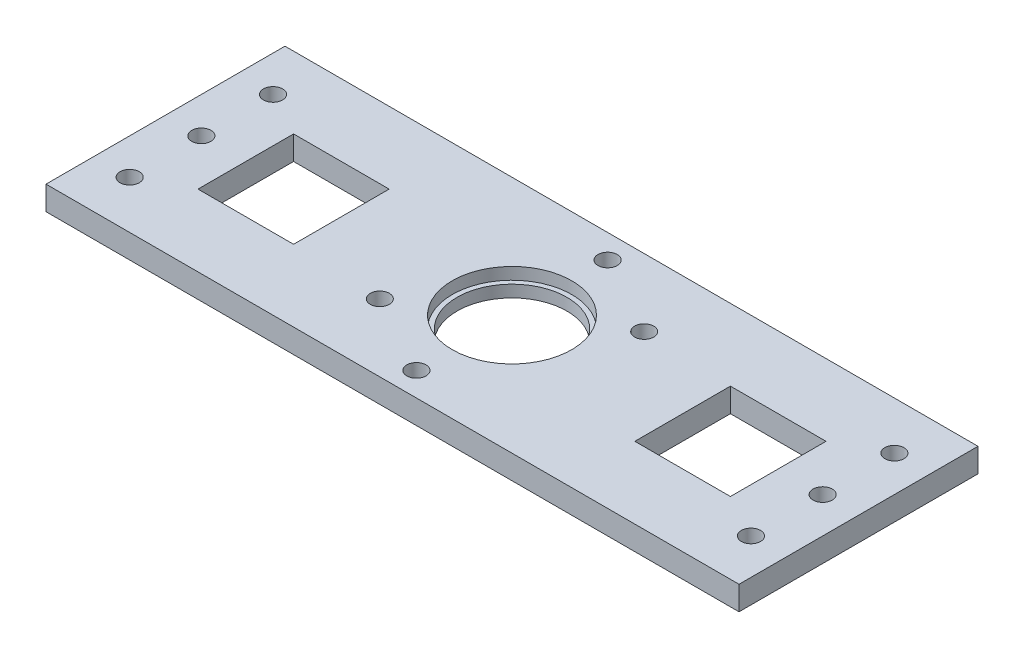
ISO-10303-21;
HEADER;
FILE_DESCRIPTION(('STEP AP214'),'2;1');
FILE_NAME('part.step','',(''),(''),'','','');
FILE_SCHEMA(('AUTOMOTIVE_DESIGN { 1 0 10303 214 1 1 1 1 }'));
ENDSEC;
DATA;
#1=APPLICATION_CONTEXT('core data for automotive mechanical design processes');
#2=APPLICATION_PROTOCOL_DEFINITION('international standard','automotive_design',2000,#1);
#3=PRODUCT_CONTEXT('',#1,'mechanical');
#4=PRODUCT('Part','Part','',(#3));
#5=PRODUCT_RELATED_PRODUCT_CATEGORY('part','',(#4));
#6=PRODUCT_DEFINITION_FORMATION('','',#4);
#7=PRODUCT_DEFINITION_CONTEXT('part definition',#1,'design');
#8=PRODUCT_DEFINITION('design','',#6,#7);
#9=PRODUCT_DEFINITION_SHAPE('','',#8);
#10=(LENGTH_UNIT() NAMED_UNIT(*) SI_UNIT(.MILLI.,.METRE.));
#11=(NAMED_UNIT(*) PLANE_ANGLE_UNIT() SI_UNIT($,.RADIAN.));
#12=(NAMED_UNIT(*) SI_UNIT($,.STERADIAN.) SOLID_ANGLE_UNIT());
#13=UNCERTAINTY_MEASURE_WITH_UNIT(LENGTH_MEASURE(1.E-05),#10,'distance_accuracy_value','');
#14=(GEOMETRIC_REPRESENTATION_CONTEXT(3) GLOBAL_UNCERTAINTY_ASSIGNED_CONTEXT((#13)) GLOBAL_UNIT_ASSIGNED_CONTEXT((#10,
#11,#12)) REPRESENTATION_CONTEXT('',''));
#15=CARTESIAN_POINT('',(0.,0.,0.));
#16=DIRECTION('',(0.,0.,1.));
#17=DIRECTION('',(1.,0.,0.));
#18=AXIS2_PLACEMENT_3D('',#15,#16,#17);
#19=CARTESIAN_POINT('',(0.,0.,0.));
#20=DIRECTION('',(0.,1.,0.));
#21=DIRECTION('',(0.,0.,1.));
#22=AXIS2_PLACEMENT_3D('',#19,#20,#21);
#23=CYLINDRICAL_SURFACE('',#22,14.605);
#24=CARTESIAN_POINT('',(0.,0.,0.));
#25=DIRECTION('',(0.,1.,0.));
#26=DIRECTION('',(0.,0.,1.));
#27=AXIS2_PLACEMENT_3D('',#24,#25,#26);
#28=CIRCLE('',#27,14.605);
#29=CARTESIAN_POINT('',(0.,0.,14.605));
#30=VERTEX_POINT('',#29);
#31=EDGE_CURVE('E259',#30,#30,#28,.T.);
#32=ORIENTED_EDGE('',*,*,#31,.F.);
#33=EDGE_LOOP('',(#32));
#34=FACE_BOUND('',#33,.T.);
#35=CARTESIAN_POINT('',(0.,3.175,0.));
#36=DIRECTION('',(0.,1.,0.));
#37=DIRECTION('',(0.,0.,1.));
#38=AXIS2_PLACEMENT_3D('',#35,#36,#37);
#39=CIRCLE('',#38,14.605);
#40=CARTESIAN_POINT('',(0.,3.175,14.605));
#41=VERTEX_POINT('',#40);
#42=EDGE_CURVE('E39',#41,#41,#39,.F.);
#43=ORIENTED_EDGE('',*,*,#42,.F.);
#44=EDGE_LOOP('',(#43));
#45=FACE_BOUND('',#44,.T.);
#46=ADVANCED_FACE('F35',(#34,#45),#23,.F.);
#47=CARTESIAN_POINT('',(92.075,6.35,31.75));
#48=DIRECTION('',(-1.,0.,0.));
#49=DIRECTION('',(0.,0.,1.));
#50=AXIS2_PLACEMENT_3D('',#47,#48,#49);
#51=PLANE('',#50);
#52=DIRECTION('',(0.,0.,-1.));
#53=VECTOR('',#52,1.);
#54=CARTESIAN_POINT('',(92.075,0.,31.75));
#55=LINE('',#54,#53);
#56=CARTESIAN_POINT('',(92.075,0.,31.75));
#57=VERTEX_POINT('',#56);
#58=CARTESIAN_POINT('',(92.075,0.,-31.75));
#59=VERTEX_POINT('',#58);
#60=EDGE_CURVE('E262',#57,#59,#55,.T.);
#61=ORIENTED_EDGE('',*,*,#60,.T.);
#62=DIRECTION('',(0.,-1.,0.));
#63=VECTOR('',#62,1.);
#64=CARTESIAN_POINT('',(92.075,6.35,-31.75));
#65=LINE('',#64,#63);
#66=CARTESIAN_POINT('',(92.075,6.35,-31.75));
#67=VERTEX_POINT('',#66);
#68=EDGE_CURVE('E11',#67,#59,#65,.T.);
#69=ORIENTED_EDGE('',*,*,#68,.F.);
#70=DIRECTION('',(0.,0.,-1.));
#71=VECTOR('',#70,1.);
#72=CARTESIAN_POINT('',(92.075,6.35,31.75));
#73=LINE('',#72,#71);
#74=CARTESIAN_POINT('',(92.075,6.35,31.75));
#75=VERTEX_POINT('',#74);
#76=EDGE_CURVE('E263',#75,#67,#73,.T.);
#77=ORIENTED_EDGE('',*,*,#76,.F.);
#78=DIRECTION('',(0.,-1.,0.));
#79=VECTOR('',#78,1.);
#80=CARTESIAN_POINT('',(92.075,6.35,31.75));
#81=LINE('',#80,#79);
#82=EDGE_CURVE('E273',#75,#57,#81,.T.);
#83=ORIENTED_EDGE('',*,*,#82,.T.);
#84=EDGE_LOOP('',(#61,#69,#77,#83));
#85=FACE_BOUND('',#84,.T.);
#86=ADVANCED_FACE('F37',(#85),#51,.F.);
#87=CARTESIAN_POINT('',(-92.075,6.35,-31.75));
#88=DIRECTION('',(0.,0.,1.));
#89=DIRECTION('',(1.,0.,0.));
#90=AXIS2_PLACEMENT_3D('',#87,#88,#89);
#91=PLANE('',#90);
#92=DIRECTION('',(-1.,0.,0.));
#93=VECTOR('',#92,1.);
#94=CARTESIAN_POINT('',(-92.075,0.,-31.75));
#95=LINE('',#94,#93);
#96=CARTESIAN_POINT('',(-92.075,0.,-31.75));
#97=VERTEX_POINT('',#96);
#98=EDGE_CURVE('E276',#59,#97,#95,.T.);
#99=ORIENTED_EDGE('',*,*,#98,.T.);
#100=DIRECTION('',(0.,-1.,0.));
#101=VECTOR('',#100,1.);
#102=CARTESIAN_POINT('',(-92.075,6.35,-31.75));
#103=LINE('',#102,#101);
#104=CARTESIAN_POINT('',(-92.075,6.35,-31.75));
#105=VERTEX_POINT('',#104);
#106=EDGE_CURVE('E44',#105,#97,#103,.T.);
#107=ORIENTED_EDGE('',*,*,#106,.F.);
#108=DIRECTION('',(-1.,0.,0.));
#109=VECTOR('',#108,1.);
#110=CARTESIAN_POINT('',(-92.075,6.35,-31.75));
#111=LINE('',#110,#109);
#112=EDGE_CURVE('E266',#67,#105,#111,.T.);
#113=ORIENTED_EDGE('',*,*,#112,.F.);
#114=ORIENTED_EDGE('',*,*,#68,.T.);
#115=EDGE_LOOP('',(#99,#107,#113,#114));
#116=FACE_BOUND('',#115,.T.);
#117=ADVANCED_FACE('F306',(#116),#91,.F.);
#118=CARTESIAN_POINT('',(-92.075,6.35,31.75));
#119=DIRECTION('',(1.,0.,0.));
#120=DIRECTION('',(0.,0.,-1.));
#121=AXIS2_PLACEMENT_3D('',#118,#119,#120);
#122=PLANE('',#121);
#123=DIRECTION('',(0.,0.,1.));
#124=VECTOR('',#123,1.);
#125=CARTESIAN_POINT('',(-92.075,0.,31.75));
#126=LINE('',#125,#124);
#127=CARTESIAN_POINT('',(-92.075,0.,31.75));
#128=VERTEX_POINT('',#127);
#129=EDGE_CURVE('E278',#97,#128,#126,.T.);
#130=ORIENTED_EDGE('',*,*,#129,.T.);
#131=DIRECTION('',(0.,-1.,0.));
#132=VECTOR('',#131,1.);
#133=CARTESIAN_POINT('',(-92.075,6.35,31.75));
#134=LINE('',#133,#132);
#135=CARTESIAN_POINT('',(-92.075,6.35,31.75));
#136=VERTEX_POINT('',#135);
#137=EDGE_CURVE('E283',#136,#128,#134,.T.);
#138=ORIENTED_EDGE('',*,*,#137,.F.);
#139=DIRECTION('',(0.,0.,1.));
#140=VECTOR('',#139,1.);
#141=CARTESIAN_POINT('',(-92.075,6.35,31.75));
#142=LINE('',#141,#140);
#143=EDGE_CURVE('E269',#105,#136,#142,.T.);
#144=ORIENTED_EDGE('',*,*,#143,.F.);
#145=ORIENTED_EDGE('',*,*,#106,.T.);
#146=EDGE_LOOP('',(#130,#138,#144,#145));
#147=FACE_BOUND('',#146,.T.);
#148=ADVANCED_FACE('F291',(#147),#122,.F.);
#149=CARTESIAN_POINT('',(-92.075,6.35,31.75));
#150=DIRECTION('',(0.,0.,-1.));
#151=DIRECTION('',(-1.,0.,0.));
#152=AXIS2_PLACEMENT_3D('',#149,#150,#151);
#153=PLANE('',#152);
#154=DIRECTION('',(1.,0.,0.));
#155=VECTOR('',#154,1.);
#156=CARTESIAN_POINT('',(-92.075,0.,31.75));
#157=LINE('',#156,#155);
#158=EDGE_CURVE('E267',#128,#57,#157,.T.);
#159=ORIENTED_EDGE('',*,*,#158,.T.);
#160=ORIENTED_EDGE('',*,*,#82,.F.);
#161=DIRECTION('',(1.,0.,0.));
#162=VECTOR('',#161,1.);
#163=CARTESIAN_POINT('',(-92.075,6.35,31.75));
#164=LINE('',#163,#162);
#165=EDGE_CURVE('E271',#136,#75,#164,.T.);
#166=ORIENTED_EDGE('',*,*,#165,.F.);
#167=ORIENTED_EDGE('',*,*,#137,.T.);
#168=EDGE_LOOP('',(#159,#160,#166,#167));
#169=FACE_BOUND('',#168,.T.);
#170=ADVANCED_FACE('F299',(#169),#153,.F.);
#171=CARTESIAN_POINT('',(0.,6.35,0.));
#172=DIRECTION('',(0.,-1.,0.));
#173=DIRECTION('',(0.,0.,-1.));
#174=AXIS2_PLACEMENT_3D('',#171,#172,#173);
#175=PLANE('',#174);
#176=DIRECTION('',(-1.,0.,0.));
#177=VECTOR('',#176,1.);
#178=CARTESIAN_POINT('',(45.339,6.35,-12.7));
#179=LINE('',#178,#177);
#180=CARTESIAN_POINT('',(70.739,6.35,-12.7));
#181=VERTEX_POINT('',#180);
#182=CARTESIAN_POINT('',(45.339,6.35,-12.7));
#183=VERTEX_POINT('',#182);
#184=EDGE_CURVE('E152',#181,#183,#179,.T.);
#185=ORIENTED_EDGE('',*,*,#184,.F.);
#186=DIRECTION('',(0.,0.,-1.));
#187=VECTOR('',#186,1.);
#188=CARTESIAN_POINT('',(70.739,6.35,-12.7));
#189=LINE('',#188,#187);
#190=CARTESIAN_POINT('',(70.739,6.35,12.7));
#191=VERTEX_POINT('',#190);
#192=EDGE_CURVE('E51',#191,#181,#189,.T.);
#193=ORIENTED_EDGE('',*,*,#192,.F.);
#194=DIRECTION('',(1.,0.,0.));
#195=VECTOR('',#194,1.);
#196=CARTESIAN_POINT('',(45.339,6.35,12.7));
#197=LINE('',#196,#195);
#198=CARTESIAN_POINT('',(45.339,6.35,12.7));
#199=VERTEX_POINT('',#198);
#200=EDGE_CURVE('E143',#199,#191,#197,.T.);
#201=ORIENTED_EDGE('',*,*,#200,.F.);
#202=DIRECTION('',(0.,0.,1.));
#203=VECTOR('',#202,1.);
#204=CARTESIAN_POINT('',(45.339,6.35,-12.7));
#205=LINE('',#204,#203);
#206=EDGE_CURVE('E146',#183,#199,#205,.T.);
#207=ORIENTED_EDGE('',*,*,#206,.F.);
#208=EDGE_LOOP('',(#185,#193,#201,#207));
#209=FACE_BOUND('',#208,.T.);
#210=DIRECTION('',(-1.,0.,0.));
#211=VECTOR('',#210,1.);
#212=CARTESIAN_POINT('',(-70.739,6.35,-12.7));
#213=LINE('',#212,#211);
#214=CARTESIAN_POINT('',(-45.339,6.35,-12.7));
#215=VERTEX_POINT('',#214);
#216=CARTESIAN_POINT('',(-70.739,6.35,-12.7));
#217=VERTEX_POINT('',#216);
#218=EDGE_CURVE('E177',#215,#217,#213,.T.);
#219=ORIENTED_EDGE('',*,*,#218,.F.);
#220=DIRECTION('',(0.,0.,-1.));
#221=VECTOR('',#220,1.);
#222=CARTESIAN_POINT('',(-45.339,6.35,-12.7));
#223=LINE('',#222,#221);
#224=CARTESIAN_POINT('',(-45.339,6.35,12.7));
#225=VERTEX_POINT('',#224);
#226=EDGE_CURVE('E158',#225,#215,#223,.T.);
#227=ORIENTED_EDGE('',*,*,#226,.F.);
#228=DIRECTION('',(1.,0.,0.));
#229=VECTOR('',#228,1.);
#230=CARTESIAN_POINT('',(-70.739,6.35,12.7));
#231=LINE('',#230,#229);
#232=CARTESIAN_POINT('',(-70.739,6.35,12.7));
#233=VERTEX_POINT('',#232);
#234=EDGE_CURVE('E166',#233,#225,#231,.T.);
#235=ORIENTED_EDGE('',*,*,#234,.F.);
#236=DIRECTION('',(0.,0.,1.));
#237=VECTOR('',#236,1.);
#238=CARTESIAN_POINT('',(-70.739,6.35,-12.7));
#239=LINE('',#238,#237);
#240=EDGE_CURVE('E180',#217,#233,#239,.T.);
#241=ORIENTED_EDGE('',*,*,#240,.F.);
#242=EDGE_LOOP('',(#219,#227,#235,#241));
#243=FACE_BOUND('',#242,.T.);
#244=CARTESIAN_POINT('',(-21.329210467338,6.35,13.7922));
#245=DIRECTION('',(0.,-1.,0.));
#246=DIRECTION('',(0.,0.,-1.));
#247=AXIS2_PLACEMENT_3D('',#244,#245,#246);
#248=CIRCLE('',#247,2.54);
#249=CARTESIAN_POINT('',(-21.329210467338,6.35,11.2522));
#250=VERTEX_POINT('',#249);
#251=EDGE_CURVE('E194',#250,#250,#248,.T.);
#252=ORIENTED_EDGE('',*,*,#251,.T.);
#253=EDGE_LOOP('',(#252));
#254=FACE_BOUND('',#253,.T.);
#255=CARTESIAN_POINT('',(21.329210467338,6.35,-13.7922));
#256=DIRECTION('',(0.,-1.,0.));
#257=DIRECTION('',(0.,0.,-1.));
#258=AXIS2_PLACEMENT_3D('',#255,#256,#257);
#259=CIRCLE('',#258,2.54);
#260=CARTESIAN_POINT('',(21.329210467338,6.35,-16.3322));
#261=VERTEX_POINT('',#260);
#262=EDGE_CURVE('E201',#261,#261,#259,.T.);
#263=ORIENTED_EDGE('',*,*,#262,.T.);
#264=EDGE_LOOP('',(#263));
#265=FACE_BOUND('',#264,.T.);
#266=CARTESIAN_POINT('',(-82.55,6.35,-19.05));
#267=DIRECTION('',(0.,1.,0.));
#268=DIRECTION('',(0.,0.,1.));
#269=AXIS2_PLACEMENT_3D('',#266,#267,#268);
#270=CIRCLE('',#269,2.55270000000001);
#271=CARTESIAN_POINT('',(-82.55,6.35,-16.4973));
#272=VERTEX_POINT('',#271);
#273=EDGE_CURVE('E197',#272,#272,#270,.T.);
#274=ORIENTED_EDGE('',*,*,#273,.F.);
#275=EDGE_LOOP('',(#274));
#276=FACE_BOUND('',#275,.T.);
#277=CARTESIAN_POINT('',(-82.55,6.35,19.05));
#278=DIRECTION('',(0.,1.,0.));
#279=DIRECTION('',(0.,0.,1.));
#280=AXIS2_PLACEMENT_3D('',#277,#278,#279);
#281=CIRCLE('',#280,2.55270000000001);
#282=CARTESIAN_POINT('',(-82.55,6.35,21.6027));
#283=VERTEX_POINT('',#282);
#284=EDGE_CURVE('E211',#283,#283,#281,.T.);
#285=ORIENTED_EDGE('',*,*,#284,.F.);
#286=EDGE_LOOP('',(#285));
#287=FACE_BOUND('',#286,.T.);
#288=CARTESIAN_POINT('',(82.55,6.35,19.05));
#289=DIRECTION('',(0.,1.,0.));
#290=DIRECTION('',(0.,0.,1.));
#291=AXIS2_PLACEMENT_3D('',#288,#289,#290);
#292=CIRCLE('',#291,2.55270000000001);
#293=CARTESIAN_POINT('',(82.55,6.35,21.6027));
#294=VERTEX_POINT('',#293);
#295=EDGE_CURVE('E217',#294,#294,#292,.T.);
#296=ORIENTED_EDGE('',*,*,#295,.F.);
#297=EDGE_LOOP('',(#296));
#298=FACE_BOUND('',#297,.T.);
#299=CARTESIAN_POINT('',(82.55,6.35,-19.05));
#300=DIRECTION('',(0.,1.,0.));
#301=DIRECTION('',(0.,0.,1.));
#302=AXIS2_PLACEMENT_3D('',#299,#300,#301);
#303=CIRCLE('',#302,2.55270000000001);
#304=CARTESIAN_POINT('',(82.55,6.35,-16.4973));
#305=VERTEX_POINT('',#304);
#306=EDGE_CURVE('E223',#305,#305,#303,.T.);
#307=ORIENTED_EDGE('',*,*,#306,.F.);
#308=EDGE_LOOP('',(#307));
#309=FACE_BOUND('',#308,.T.);
#310=CARTESIAN_POINT('',(-82.55,6.35,0.));
#311=DIRECTION('',(0.,1.,0.));
#312=DIRECTION('',(0.,0.,1.));
#313=AXIS2_PLACEMENT_3D('',#310,#311,#312);
#314=CIRCLE('',#313,2.55270000000001);
#315=CARTESIAN_POINT('',(-82.55,6.35,2.55270000000001));
#316=VERTEX_POINT('',#315);
#317=EDGE_CURVE('E229',#316,#316,#314,.T.);
#318=ORIENTED_EDGE('',*,*,#317,.F.);
#319=EDGE_LOOP('',(#318));
#320=FACE_BOUND('',#319,.T.);
#321=CARTESIAN_POINT('',(82.55,6.35,0.));
#322=DIRECTION('',(0.,1.,0.));
#323=DIRECTION('',(0.,0.,1.));
#324=AXIS2_PLACEMENT_3D('',#321,#322,#323);
#325=CIRCLE('',#324,2.55270000000001);
#326=CARTESIAN_POINT('',(82.55,6.35,2.55270000000001));
#327=VERTEX_POINT('',#326);
#328=EDGE_CURVE('E235',#327,#327,#325,.T.);
#329=ORIENTED_EDGE('',*,*,#328,.F.);
#330=EDGE_LOOP('',(#329));
#331=FACE_BOUND('',#330,.T.);
#332=CARTESIAN_POINT('',(0.,6.35,0.));
#333=DIRECTION('',(0.,1.,0.));
#334=DIRECTION('',(0.,0.,1.));
#335=AXIS2_PLACEMENT_3D('',#332,#333,#334);
#336=CIRCLE('',#335,15.875);
#337=CARTESIAN_POINT('',(0.,6.35,15.875));
#338=VERTEX_POINT('',#337);
#339=EDGE_CURVE('E241',#338,#338,#336,.T.);
#340=ORIENTED_EDGE('',*,*,#339,.F.);
#341=EDGE_LOOP('',(#340));
#342=FACE_BOUND('',#341,.T.);
#343=CARTESIAN_POINT('',(0.,6.35,25.4));
#344=DIRECTION('',(0.,-1.,0.));
#345=DIRECTION('',(0.,0.,-1.));
#346=AXIS2_PLACEMENT_3D('',#343,#344,#345);
#347=CIRCLE('',#346,2.5527);
#348=CARTESIAN_POINT('',(0.,6.35,22.8473));
#349=VERTEX_POINT('',#348);
#350=EDGE_CURVE('E250',#349,#349,#347,.T.);
#351=ORIENTED_EDGE('',*,*,#350,.T.);
#352=EDGE_LOOP('',(#351));
#353=FACE_BOUND('',#352,.T.);
#354=CARTESIAN_POINT('',(0.,6.35,-25.4));
#355=DIRECTION('',(0.,-1.,0.));
#356=DIRECTION('',(0.,0.,-1.));
#357=AXIS2_PLACEMENT_3D('',#354,#355,#356);
#358=CIRCLE('',#357,2.5527);
#359=CARTESIAN_POINT('',(0.,6.35,-27.9527));
#360=VERTEX_POINT('',#359);
#361=EDGE_CURVE('E256',#360,#360,#358,.T.);
#362=ORIENTED_EDGE('',*,*,#361,.T.);
#363=EDGE_LOOP('',(#362));
#364=FACE_BOUND('',#363,.T.);
#365=ORIENTED_EDGE('',*,*,#76,.T.);
#366=ORIENTED_EDGE('',*,*,#112,.T.);
#367=ORIENTED_EDGE('',*,*,#143,.T.);
#368=ORIENTED_EDGE('',*,*,#165,.T.);
#369=EDGE_LOOP('',(#365,#366,#367,#368));
#370=FACE_BOUND('',#369,.T.);
#371=ADVANCED_FACE('F305',(#209,#243,#254,#265,#276,#287,#298,#309,#320,#331,#342,#353,#364,
#370),#175,.F.);
#372=CARTESIAN_POINT('',(0.,0.,0.));
#373=DIRECTION('',(0.,-1.,0.));
#374=DIRECTION('',(0.,0.,-1.));
#375=AXIS2_PLACEMENT_3D('',#372,#373,#374);
#376=PLANE('',#375);
#377=DIRECTION('',(0.,0.,-1.));
#378=VECTOR('',#377,1.);
#379=CARTESIAN_POINT('',(70.739,0.,-12.7));
#380=LINE('',#379,#378);
#381=CARTESIAN_POINT('',(70.739,0.,12.7));
#382=VERTEX_POINT('',#381);
#383=CARTESIAN_POINT('',(70.739,0.,-12.7));
#384=VERTEX_POINT('',#383);
#385=EDGE_CURVE('E127',#382,#384,#380,.T.);
#386=ORIENTED_EDGE('',*,*,#385,.T.);
#387=DIRECTION('',(-1.,0.,0.));
#388=VECTOR('',#387,1.);
#389=CARTESIAN_POINT('',(45.339,0.,-12.7));
#390=LINE('',#389,#388);
#391=CARTESIAN_POINT('',(45.339,0.,-12.7));
#392=VERTEX_POINT('',#391);
#393=EDGE_CURVE('E136',#384,#392,#390,.T.);
#394=ORIENTED_EDGE('',*,*,#393,.T.);
#395=DIRECTION('',(0.,0.,1.));
#396=VECTOR('',#395,1.);
#397=CARTESIAN_POINT('',(45.339,0.,-12.7));
#398=LINE('',#397,#396);
#399=CARTESIAN_POINT('',(45.339,0.,12.7));
#400=VERTEX_POINT('',#399);
#401=EDGE_CURVE('E59',#392,#400,#398,.T.);
#402=ORIENTED_EDGE('',*,*,#401,.T.);
#403=DIRECTION('',(1.,0.,0.));
#404=VECTOR('',#403,1.);
#405=CARTESIAN_POINT('',(45.339,0.,12.7));
#406=LINE('',#405,#404);
#407=EDGE_CURVE('E133',#400,#382,#406,.T.);
#408=ORIENTED_EDGE('',*,*,#407,.T.);
#409=EDGE_LOOP('',(#386,#394,#402,#408));
#410=FACE_BOUND('',#409,.T.);
#411=DIRECTION('',(0.,0.,-1.));
#412=VECTOR('',#411,1.);
#413=CARTESIAN_POINT('',(-45.339,0.,-12.7));
#414=LINE('',#413,#412);
#415=CARTESIAN_POINT('',(-45.339,0.,12.7));
#416=VERTEX_POINT('',#415);
#417=CARTESIAN_POINT('',(-45.339,0.,-12.7));
#418=VERTEX_POINT('',#417);
#419=EDGE_CURVE('E162',#416,#418,#414,.T.);
#420=ORIENTED_EDGE('',*,*,#419,.T.);
#421=DIRECTION('',(-1.,0.,0.));
#422=VECTOR('',#421,1.);
#423=CARTESIAN_POINT('',(-70.739,0.,-12.7));
#424=LINE('',#423,#422);
#425=CARTESIAN_POINT('',(-70.739,0.,-12.7));
#426=VERTEX_POINT('',#425);
#427=EDGE_CURVE('E165',#418,#426,#424,.T.);
#428=ORIENTED_EDGE('',*,*,#427,.T.);
#429=DIRECTION('',(0.,0.,1.));
#430=VECTOR('',#429,1.);
#431=CARTESIAN_POINT('',(-70.739,0.,-12.7));
#432=LINE('',#431,#430);
#433=CARTESIAN_POINT('',(-70.739,0.,12.7));
#434=VERTEX_POINT('',#433);
#435=EDGE_CURVE('E169',#426,#434,#432,.T.);
#436=ORIENTED_EDGE('',*,*,#435,.T.);
#437=DIRECTION('',(1.,0.,0.));
#438=VECTOR('',#437,1.);
#439=CARTESIAN_POINT('',(-70.739,0.,12.7));
#440=LINE('',#439,#438);
#441=EDGE_CURVE('E172',#434,#416,#440,.T.);
#442=ORIENTED_EDGE('',*,*,#441,.T.);
#443=EDGE_LOOP('',(#420,#428,#436,#442));
#444=FACE_BOUND('',#443,.T.);
#445=CARTESIAN_POINT('',(-21.329210467338,0.,13.7922));
#446=DIRECTION('',(0.,-1.,0.));
#447=DIRECTION('',(0.,0.,-1.));
#448=AXIS2_PLACEMENT_3D('',#445,#446,#447);
#449=CIRCLE('',#448,2.54);
#450=CARTESIAN_POINT('',(-21.329210467338,0.,11.2522));
#451=VERTEX_POINT('',#450);
#452=EDGE_CURVE('E198',#451,#451,#449,.T.);
#453=ORIENTED_EDGE('',*,*,#452,.F.);
#454=EDGE_LOOP('',(#453));
#455=FACE_BOUND('',#454,.T.);
#456=CARTESIAN_POINT('',(21.329210467338,0.,-13.7922));
#457=DIRECTION('',(0.,-1.,0.));
#458=DIRECTION('',(0.,0.,-1.));
#459=AXIS2_PLACEMENT_3D('',#456,#457,#458);
#460=CIRCLE('',#459,2.54);
#461=CARTESIAN_POINT('',(21.329210467338,0.,-16.3322));
#462=VERTEX_POINT('',#461);
#463=EDGE_CURVE('E187',#462,#462,#460,.T.);
#464=ORIENTED_EDGE('',*,*,#463,.F.);
#465=EDGE_LOOP('',(#464));
#466=FACE_BOUND('',#465,.T.);
#467=CARTESIAN_POINT('',(-82.55,0.,-19.05));
#468=DIRECTION('',(0.,1.,0.));
#469=DIRECTION('',(0.,0.,1.));
#470=AXIS2_PLACEMENT_3D('',#467,#468,#469);
#471=CIRCLE('',#470,2.55270000000001);
#472=CARTESIAN_POINT('',(-82.55,0.,-16.4973));
#473=VERTEX_POINT('',#472);
#474=EDGE_CURVE('E208',#473,#473,#471,.T.);
#475=ORIENTED_EDGE('',*,*,#474,.T.);
#476=EDGE_LOOP('',(#475));
#477=FACE_BOUND('',#476,.T.);
#478=CARTESIAN_POINT('',(-82.55,0.,19.05));
#479=DIRECTION('',(0.,1.,0.));
#480=DIRECTION('',(0.,0.,1.));
#481=AXIS2_PLACEMENT_3D('',#478,#479,#480);
#482=CIRCLE('',#481,2.55270000000001);
#483=CARTESIAN_POINT('',(-82.55,0.,21.6027));
#484=VERTEX_POINT('',#483);
#485=EDGE_CURVE('E214',#484,#484,#482,.T.);
#486=ORIENTED_EDGE('',*,*,#485,.T.);
#487=EDGE_LOOP('',(#486));
#488=FACE_BOUND('',#487,.T.);
#489=CARTESIAN_POINT('',(82.55,0.,19.05));
#490=DIRECTION('',(0.,1.,0.));
#491=DIRECTION('',(0.,0.,1.));
#492=AXIS2_PLACEMENT_3D('',#489,#490,#491);
#493=CIRCLE('',#492,2.55270000000001);
#494=CARTESIAN_POINT('',(82.55,0.,21.6027));
#495=VERTEX_POINT('',#494);
#496=EDGE_CURVE('E220',#495,#495,#493,.T.);
#497=ORIENTED_EDGE('',*,*,#496,.T.);
#498=EDGE_LOOP('',(#497));
#499=FACE_BOUND('',#498,.T.);
#500=CARTESIAN_POINT('',(82.55,0.,-19.05));
#501=DIRECTION('',(0.,1.,0.));
#502=DIRECTION('',(0.,0.,1.));
#503=AXIS2_PLACEMENT_3D('',#500,#501,#502);
#504=CIRCLE('',#503,2.55270000000001);
#505=CARTESIAN_POINT('',(82.55,0.,-16.4973));
#506=VERTEX_POINT('',#505);
#507=EDGE_CURVE('E226',#506,#506,#504,.T.);
#508=ORIENTED_EDGE('',*,*,#507,.T.);
#509=EDGE_LOOP('',(#508));
#510=FACE_BOUND('',#509,.T.);
#511=CARTESIAN_POINT('',(-82.55,0.,0.));
#512=DIRECTION('',(0.,1.,0.));
#513=DIRECTION('',(0.,0.,1.));
#514=AXIS2_PLACEMENT_3D('',#511,#512,#513);
#515=CIRCLE('',#514,2.55270000000001);
#516=CARTESIAN_POINT('',(-82.55,0.,2.55270000000001));
#517=VERTEX_POINT('',#516);
#518=EDGE_CURVE('E232',#517,#517,#515,.T.);
#519=ORIENTED_EDGE('',*,*,#518,.T.);
#520=EDGE_LOOP('',(#519));
#521=FACE_BOUND('',#520,.T.);
#522=CARTESIAN_POINT('',(82.55,0.,0.));
#523=DIRECTION('',(0.,1.,0.));
#524=DIRECTION('',(0.,0.,1.));
#525=AXIS2_PLACEMENT_3D('',#522,#523,#524);
#526=CIRCLE('',#525,2.55270000000001);
#527=CARTESIAN_POINT('',(82.55,0.,2.55270000000001));
#528=VERTEX_POINT('',#527);
#529=EDGE_CURVE('E238',#528,#528,#526,.T.);
#530=ORIENTED_EDGE('',*,*,#529,.T.);
#531=EDGE_LOOP('',(#530));
#532=FACE_BOUND('',#531,.T.);
#533=CARTESIAN_POINT('',(0.,0.,25.4));
#534=DIRECTION('',(0.,-1.,0.));
#535=DIRECTION('',(0.,0.,-1.));
#536=AXIS2_PLACEMENT_3D('',#533,#534,#535);
#537=CIRCLE('',#536,2.5527);
#538=CARTESIAN_POINT('',(0.,0.,22.8473));
#539=VERTEX_POINT('',#538);
#540=EDGE_CURVE('E247',#539,#539,#537,.T.);
#541=ORIENTED_EDGE('',*,*,#540,.F.);
#542=EDGE_LOOP('',(#541));
#543=FACE_BOUND('',#542,.T.);
#544=CARTESIAN_POINT('',(0.,0.,-25.4));
#545=DIRECTION('',(0.,-1.,0.));
#546=DIRECTION('',(0.,0.,-1.));
#547=AXIS2_PLACEMENT_3D('',#544,#545,#546);
#548=CIRCLE('',#547,2.5527);
#549=CARTESIAN_POINT('',(0.,0.,-27.9527));
#550=VERTEX_POINT('',#549);
#551=EDGE_CURVE('E253',#550,#550,#548,.T.);
#552=ORIENTED_EDGE('',*,*,#551,.F.);
#553=EDGE_LOOP('',(#552));
#554=FACE_BOUND('',#553,.T.);
#555=ORIENTED_EDGE('',*,*,#31,.T.);
#556=EDGE_LOOP('',(#555));
#557=FACE_BOUND('',#556,.T.);
#558=ORIENTED_EDGE('',*,*,#60,.F.);
#559=ORIENTED_EDGE('',*,*,#158,.F.);
#560=ORIENTED_EDGE('',*,*,#129,.F.);
#561=ORIENTED_EDGE('',*,*,#98,.F.);
#562=EDGE_LOOP('',(#558,#559,#560,#561));
#563=FACE_BOUND('',#562,.T.);
#564=ADVANCED_FACE('F140',(#410,#444,#455,#466,#477,#488,#499,#510,#521,#532,#543,#554,#557,
#563),#376,.T.);
#565=CARTESIAN_POINT('',(0.,0.,-25.4));
#566=DIRECTION('',(0.,-1.,0.));
#567=DIRECTION('',(0.,0.,-1.));
#568=AXIS2_PLACEMENT_3D('',#565,#566,#567);
#569=CYLINDRICAL_SURFACE('',#568,2.5527);
#570=ORIENTED_EDGE('',*,*,#361,.F.);
#571=EDGE_LOOP('',(#570));
#572=FACE_BOUND('',#571,.T.);
#573=ORIENTED_EDGE('',*,*,#551,.T.);
#574=EDGE_LOOP('',(#573));
#575=FACE_BOUND('',#574,.T.);
#576=ADVANCED_FACE('F322',(#572,#575),#569,.F.);
#577=CARTESIAN_POINT('',(0.,0.,25.4));
#578=DIRECTION('',(0.,-1.,0.));
#579=DIRECTION('',(0.,0.,-1.));
#580=AXIS2_PLACEMENT_3D('',#577,#578,#579);
#581=CYLINDRICAL_SURFACE('',#580,2.5527);
#582=ORIENTED_EDGE('',*,*,#350,.F.);
#583=EDGE_LOOP('',(#582));
#584=FACE_BOUND('',#583,.T.);
#585=ORIENTED_EDGE('',*,*,#540,.T.);
#586=EDGE_LOOP('',(#585));
#587=FACE_BOUND('',#586,.T.);
#588=ADVANCED_FACE('F350',(#584,#587),#581,.F.);
#589=CARTESIAN_POINT('',(0.,3.175,0.));
#590=DIRECTION('',(0.,1.,0.));
#591=DIRECTION('',(0.,0.,1.));
#592=AXIS2_PLACEMENT_3D('',#589,#590,#591);
#593=PLANE('',#592);
#594=CARTESIAN_POINT('',(0.,3.175,0.));
#595=DIRECTION('',(0.,1.,0.));
#596=DIRECTION('',(0.,0.,1.));
#597=AXIS2_PLACEMENT_3D('',#594,#595,#596);
#598=CIRCLE('',#597,15.875);
#599=CARTESIAN_POINT('',(0.,3.175,15.875));
#600=VERTEX_POINT('',#599);
#601=EDGE_CURVE('E242',#600,#600,#598,.T.);
#602=ORIENTED_EDGE('',*,*,#601,.T.);
#603=EDGE_LOOP('',(#602));
#604=FACE_BOUND('',#603,.T.);
#605=ORIENTED_EDGE('',*,*,#42,.T.);
#606=EDGE_LOOP('',(#605));
#607=FACE_BOUND('',#606,.T.);
#608=ADVANCED_FACE('F357',(#604,#607),#593,.T.);
#609=CARTESIAN_POINT('',(0.,3.175,0.));
#610=DIRECTION('',(0.,1.,0.));
#611=DIRECTION('',(0.,0.,1.));
#612=AXIS2_PLACEMENT_3D('',#609,#610,#611);
#613=CYLINDRICAL_SURFACE('',#612,15.875);
#614=ORIENTED_EDGE('',*,*,#601,.F.);
#615=EDGE_LOOP('',(#614));
#616=FACE_BOUND('',#615,.T.);
#617=ORIENTED_EDGE('',*,*,#339,.T.);
#618=EDGE_LOOP('',(#617));
#619=FACE_BOUND('',#618,.T.);
#620=ADVANCED_FACE('F364',(#616,#619),#613,.F.);
#621=CARTESIAN_POINT('',(82.55,6.35,0.));
#622=DIRECTION('',(0.,1.,0.));
#623=DIRECTION('',(0.,0.,1.));
#624=AXIS2_PLACEMENT_3D('',#621,#622,#623);
#625=CYLINDRICAL_SURFACE('',#624,2.55270000000001);
#626=ORIENTED_EDGE('',*,*,#529,.F.);
#627=EDGE_LOOP('',(#626));
#628=FACE_BOUND('',#627,.T.);
#629=ORIENTED_EDGE('',*,*,#328,.T.);
#630=EDGE_LOOP('',(#629));
#631=FACE_BOUND('',#630,.T.);
#632=ADVANCED_FACE('F372',(#628,#631),#625,.F.);
#633=CARTESIAN_POINT('',(-82.55,6.35,0.));
#634=DIRECTION('',(0.,1.,0.));
#635=DIRECTION('',(0.,0.,1.));
#636=AXIS2_PLACEMENT_3D('',#633,#634,#635);
#637=CYLINDRICAL_SURFACE('',#636,2.55270000000001);
#638=ORIENTED_EDGE('',*,*,#518,.F.);
#639=EDGE_LOOP('',(#638));
#640=FACE_BOUND('',#639,.T.);
#641=ORIENTED_EDGE('',*,*,#317,.T.);
#642=EDGE_LOOP('',(#641));
#643=FACE_BOUND('',#642,.T.);
#644=ADVANCED_FACE('F380',(#640,#643),#637,.F.);
#645=CARTESIAN_POINT('',(82.55,6.35,-19.05));
#646=DIRECTION('',(0.,1.,0.));
#647=DIRECTION('',(0.,0.,1.));
#648=AXIS2_PLACEMENT_3D('',#645,#646,#647);
#649=CYLINDRICAL_SURFACE('',#648,2.55270000000001);
#650=ORIENTED_EDGE('',*,*,#507,.F.);
#651=EDGE_LOOP('',(#650));
#652=FACE_BOUND('',#651,.T.);
#653=ORIENTED_EDGE('',*,*,#306,.T.);
#654=EDGE_LOOP('',(#653));
#655=FACE_BOUND('',#654,.T.);
#656=ADVANCED_FACE('F388',(#652,#655),#649,.F.);
#657=CARTESIAN_POINT('',(82.55,6.35,19.05));
#658=DIRECTION('',(0.,1.,0.));
#659=DIRECTION('',(0.,0.,1.));
#660=AXIS2_PLACEMENT_3D('',#657,#658,#659);
#661=CYLINDRICAL_SURFACE('',#660,2.55270000000001);
#662=ORIENTED_EDGE('',*,*,#496,.F.);
#663=EDGE_LOOP('',(#662));
#664=FACE_BOUND('',#663,.T.);
#665=ORIENTED_EDGE('',*,*,#295,.T.);
#666=EDGE_LOOP('',(#665));
#667=FACE_BOUND('',#666,.T.);
#668=ADVANCED_FACE('F396',(#664,#667),#661,.F.);
#669=CARTESIAN_POINT('',(-82.55,6.35,19.05));
#670=DIRECTION('',(0.,1.,0.));
#671=DIRECTION('',(0.,0.,1.));
#672=AXIS2_PLACEMENT_3D('',#669,#670,#671);
#673=CYLINDRICAL_SURFACE('',#672,2.55270000000001);
#674=ORIENTED_EDGE('',*,*,#485,.F.);
#675=EDGE_LOOP('',(#674));
#676=FACE_BOUND('',#675,.T.);
#677=ORIENTED_EDGE('',*,*,#284,.T.);
#678=EDGE_LOOP('',(#677));
#679=FACE_BOUND('',#678,.T.);
#680=ADVANCED_FACE('F404',(#676,#679),#673,.F.);
#681=CARTESIAN_POINT('',(-82.55,6.35,-19.05));
#682=DIRECTION('',(0.,1.,0.));
#683=DIRECTION('',(0.,0.,1.));
#684=AXIS2_PLACEMENT_3D('',#681,#682,#683);
#685=CYLINDRICAL_SURFACE('',#684,2.55270000000001);
#686=ORIENTED_EDGE('',*,*,#474,.F.);
#687=EDGE_LOOP('',(#686));
#688=FACE_BOUND('',#687,.T.);
#689=ORIENTED_EDGE('',*,*,#273,.T.);
#690=EDGE_LOOP('',(#689));
#691=FACE_BOUND('',#690,.T.);
#692=ADVANCED_FACE('F412',(#688,#691),#685,.F.);
#693=CARTESIAN_POINT('',(21.329210467338,6.35,-13.7922));
#694=DIRECTION('',(0.,-1.,0.));
#695=DIRECTION('',(0.,0.,-1.));
#696=AXIS2_PLACEMENT_3D('',#693,#694,#695);
#697=CYLINDRICAL_SURFACE('',#696,2.54);
#698=ORIENTED_EDGE('',*,*,#262,.F.);
#699=EDGE_LOOP('',(#698));
#700=FACE_BOUND('',#699,.T.);
#701=ORIENTED_EDGE('',*,*,#463,.T.);
#702=EDGE_LOOP('',(#701));
#703=FACE_BOUND('',#702,.T.);
#704=ADVANCED_FACE('F420',(#700,#703),#697,.F.);
#705=CARTESIAN_POINT('',(-21.329210467338,6.35,13.7922));
#706=DIRECTION('',(0.,-1.,0.));
#707=DIRECTION('',(0.,0.,-1.));
#708=AXIS2_PLACEMENT_3D('',#705,#706,#707);
#709=CYLINDRICAL_SURFACE('',#708,2.54);
#710=ORIENTED_EDGE('',*,*,#251,.F.);
#711=EDGE_LOOP('',(#710));
#712=FACE_BOUND('',#711,.T.);
#713=ORIENTED_EDGE('',*,*,#452,.T.);
#714=EDGE_LOOP('',(#713));
#715=FACE_BOUND('',#714,.T.);
#716=ADVANCED_FACE('F428',(#712,#715),#709,.F.);
#717=CARTESIAN_POINT('',(-45.339,0.,-12.7));
#718=DIRECTION('',(1.,0.,0.));
#719=DIRECTION('',(0.,0.,-1.));
#720=AXIS2_PLACEMENT_3D('',#717,#718,#719);
#721=PLANE('',#720);
#722=ORIENTED_EDGE('',*,*,#226,.T.);
#723=DIRECTION('',(0.,1.,0.));
#724=VECTOR('',#723,1.);
#725=CARTESIAN_POINT('',(-45.339,0.,-12.7));
#726=LINE('',#725,#724);
#727=EDGE_CURVE('E175',#418,#215,#726,.T.);
#728=ORIENTED_EDGE('',*,*,#727,.F.);
#729=ORIENTED_EDGE('',*,*,#419,.F.);
#730=DIRECTION('',(0.,1.,0.));
#731=VECTOR('',#730,1.);
#732=CARTESIAN_POINT('',(-45.339,0.,12.7));
#733=LINE('',#732,#731);
#734=EDGE_CURVE('E185',#416,#225,#733,.T.);
#735=ORIENTED_EDGE('',*,*,#734,.T.);
#736=EDGE_LOOP('',(#722,#728,#729,#735));
#737=FACE_BOUND('',#736,.T.);
#738=ADVANCED_FACE('F436',(#737),#721,.F.);
#739=CARTESIAN_POINT('',(-70.739,0.,12.7));
#740=DIRECTION('',(0.,0.,1.));
#741=DIRECTION('',(1.,0.,0.));
#742=AXIS2_PLACEMENT_3D('',#739,#740,#741);
#743=PLANE('',#742);
#744=ORIENTED_EDGE('',*,*,#234,.T.);
#745=ORIENTED_EDGE('',*,*,#734,.F.);
#746=ORIENTED_EDGE('',*,*,#441,.F.);
#747=DIRECTION('',(0.,1.,0.));
#748=VECTOR('',#747,1.);
#749=CARTESIAN_POINT('',(-70.739,0.,12.7));
#750=LINE('',#749,#748);
#751=EDGE_CURVE('E188',#434,#233,#750,.T.);
#752=ORIENTED_EDGE('',*,*,#751,.T.);
#753=EDGE_LOOP('',(#744,#745,#746,#752));
#754=FACE_BOUND('',#753,.T.);
#755=ADVANCED_FACE('F444',(#754),#743,.F.);
#756=CARTESIAN_POINT('',(-70.739,0.,-12.7));
#757=DIRECTION('',(-1.,0.,0.));
#758=DIRECTION('',(0.,0.,1.));
#759=AXIS2_PLACEMENT_3D('',#756,#757,#758);
#760=PLANE('',#759);
#761=ORIENTED_EDGE('',*,*,#240,.T.);
#762=ORIENTED_EDGE('',*,*,#751,.F.);
#763=ORIENTED_EDGE('',*,*,#435,.F.);
#764=DIRECTION('',(0.,1.,0.));
#765=VECTOR('',#764,1.);
#766=CARTESIAN_POINT('',(-70.739,0.,-12.7));
#767=LINE('',#766,#765);
#768=EDGE_CURVE('E190',#426,#217,#767,.T.);
#769=ORIENTED_EDGE('',*,*,#768,.T.);
#770=EDGE_LOOP('',(#761,#762,#763,#769));
#771=FACE_BOUND('',#770,.T.);
#772=ADVANCED_FACE('F452',(#771),#760,.F.);
#773=CARTESIAN_POINT('',(-70.739,0.,-12.7));
#774=DIRECTION('',(0.,0.,-1.));
#775=DIRECTION('',(-1.,0.,0.));
#776=AXIS2_PLACEMENT_3D('',#773,#774,#775);
#777=PLANE('',#776);
#778=ORIENTED_EDGE('',*,*,#218,.T.);
#779=ORIENTED_EDGE('',*,*,#768,.F.);
#780=ORIENTED_EDGE('',*,*,#427,.F.);
#781=ORIENTED_EDGE('',*,*,#727,.T.);
#782=EDGE_LOOP('',(#778,#779,#780,#781));
#783=FACE_BOUND('',#782,.T.);
#784=ADVANCED_FACE('F460',(#783),#777,.F.);
#785=CARTESIAN_POINT('',(70.739,0.,-12.7));
#786=DIRECTION('',(1.,0.,0.));
#787=DIRECTION('',(0.,0.,-1.));
#788=AXIS2_PLACEMENT_3D('',#785,#786,#787);
#789=PLANE('',#788);
#790=ORIENTED_EDGE('',*,*,#192,.T.);
#791=DIRECTION('',(0.,1.,0.));
#792=VECTOR('',#791,1.);
#793=CARTESIAN_POINT('',(70.739,0.,-12.7));
#794=LINE('',#793,#792);
#795=EDGE_CURVE('E123',#384,#181,#794,.T.);
#796=ORIENTED_EDGE('',*,*,#795,.F.);
#797=ORIENTED_EDGE('',*,*,#385,.F.);
#798=DIRECTION('',(0.,1.,0.));
#799=VECTOR('',#798,1.);
#800=CARTESIAN_POINT('',(70.739,0.,12.7));
#801=LINE('',#800,#799);
#802=EDGE_CURVE('E156',#382,#191,#801,.T.);
#803=ORIENTED_EDGE('',*,*,#802,.T.);
#804=EDGE_LOOP('',(#790,#796,#797,#803));
#805=FACE_BOUND('',#804,.T.);
#806=ADVANCED_FACE('F125',(#805),#789,.F.);
#807=CARTESIAN_POINT('',(45.339,0.,12.7));
#808=DIRECTION('',(0.,0.,1.));
#809=DIRECTION('',(1.,0.,0.));
#810=AXIS2_PLACEMENT_3D('',#807,#808,#809);
#811=PLANE('',#810);
#812=ORIENTED_EDGE('',*,*,#200,.T.);
#813=ORIENTED_EDGE('',*,*,#802,.F.);
#814=ORIENTED_EDGE('',*,*,#407,.F.);
#815=DIRECTION('',(0.,1.,0.));
#816=VECTOR('',#815,1.);
#817=CARTESIAN_POINT('',(45.339,0.,12.7));
#818=LINE('',#817,#816);
#819=EDGE_CURVE('E159',#400,#199,#818,.T.);
#820=ORIENTED_EDGE('',*,*,#819,.T.);
#821=EDGE_LOOP('',(#812,#813,#814,#820));
#822=FACE_BOUND('',#821,.T.);
#823=ADVANCED_FACE('F473',(#822),#811,.F.);
#824=CARTESIAN_POINT('',(45.339,0.,-12.7));
#825=DIRECTION('',(-1.,0.,0.));
#826=DIRECTION('',(0.,0.,1.));
#827=AXIS2_PLACEMENT_3D('',#824,#825,#826);
#828=PLANE('',#827);
#829=ORIENTED_EDGE('',*,*,#206,.T.);
#830=ORIENTED_EDGE('',*,*,#819,.F.);
#831=ORIENTED_EDGE('',*,*,#401,.F.);
#832=DIRECTION('',(0.,1.,0.));
#833=VECTOR('',#832,1.);
#834=CARTESIAN_POINT('',(45.339,0.,-12.7));
#835=LINE('',#834,#833);
#836=EDGE_CURVE('E132',#392,#183,#835,.T.);
#837=ORIENTED_EDGE('',*,*,#836,.T.);
#838=EDGE_LOOP('',(#829,#830,#831,#837));
#839=FACE_BOUND('',#838,.T.);
#840=ADVANCED_FACE('F480',(#839),#828,.F.);
#841=CARTESIAN_POINT('',(45.339,0.,-12.7));
#842=DIRECTION('',(0.,0.,-1.));
#843=DIRECTION('',(-1.,0.,0.));
#844=AXIS2_PLACEMENT_3D('',#841,#842,#843);
#845=PLANE('',#844);
#846=ORIENTED_EDGE('',*,*,#184,.T.);
#847=ORIENTED_EDGE('',*,*,#836,.F.);
#848=ORIENTED_EDGE('',*,*,#393,.F.);
#849=ORIENTED_EDGE('',*,*,#795,.T.);
#850=EDGE_LOOP('',(#846,#847,#848,#849));
#851=FACE_BOUND('',#850,.T.);
#852=ADVANCED_FACE('F137',(#851),#845,.F.);
#853=CLOSED_SHELL('',(#46,#86,#117,#148,#170,#371,#564,#576,#588,#608,#620,#632,#644,#656,#668,
#680,#692,#704,#716,#738,#755,#772,#784,#806,#823,#840,#852));
#854=MANIFOLD_SOLID_BREP('B2',#853);
#855=ADVANCED_BREP_SHAPE_REPRESENTATION('',(#18,#854),#14);
#856=SHAPE_DEFINITION_REPRESENTATION(#9,#855);
ENDSEC;
END-ISO-10303-21;
